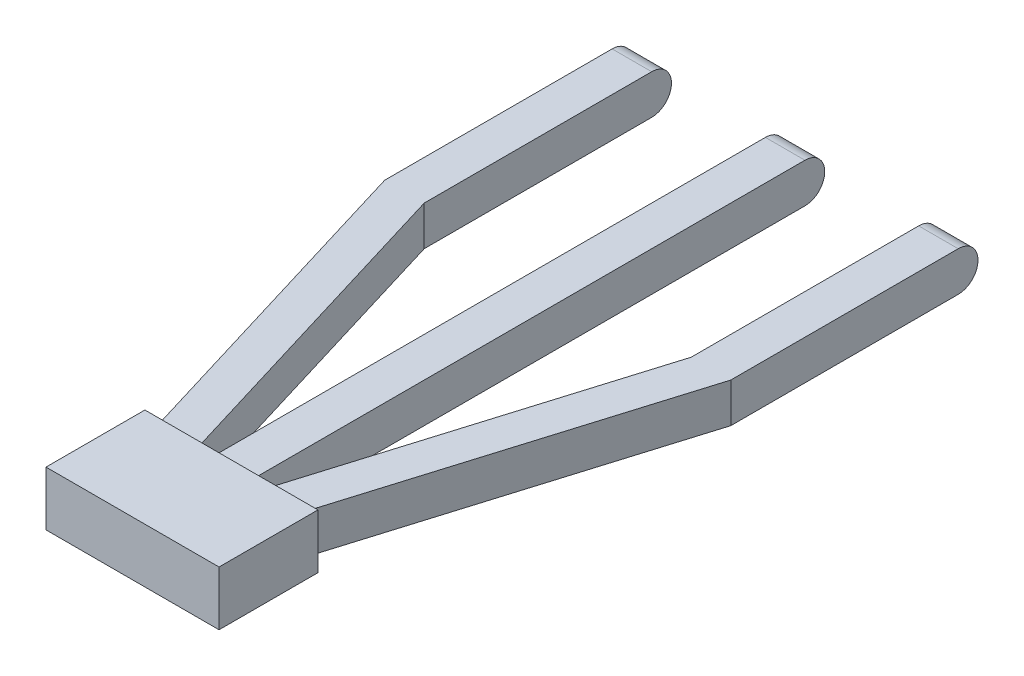
ISO-10303-21;
HEADER;
FILE_DESCRIPTION(('STEP AP214'),'2;1');
FILE_NAME('part.step','',(''),(''),'','','');
FILE_SCHEMA(('AUTOMOTIVE_DESIGN { 1 0 10303 214 1 1 1 1 }'));
ENDSEC;
DATA;
#1=APPLICATION_CONTEXT('core data for automotive mechanical design processes');
#2=APPLICATION_PROTOCOL_DEFINITION('international standard','automotive_design',2000,#1);
#3=PRODUCT_CONTEXT('',#1,'mechanical');
#4=PRODUCT('Part','Part','',(#3));
#5=PRODUCT_RELATED_PRODUCT_CATEGORY('part','',(#4));
#6=PRODUCT_DEFINITION_FORMATION('','',#4);
#7=PRODUCT_DEFINITION_CONTEXT('part definition',#1,'design');
#8=PRODUCT_DEFINITION('design','',#6,#7);
#9=PRODUCT_DEFINITION_SHAPE('','',#8);
#10=(LENGTH_UNIT() NAMED_UNIT(*) SI_UNIT(.MILLI.,.METRE.));
#11=(NAMED_UNIT(*) PLANE_ANGLE_UNIT() SI_UNIT($,.RADIAN.));
#12=(NAMED_UNIT(*) SI_UNIT($,.STERADIAN.) SOLID_ANGLE_UNIT());
#13=UNCERTAINTY_MEASURE_WITH_UNIT(LENGTH_MEASURE(1.E-05),#10,'distance_accuracy_value','');
#14=(GEOMETRIC_REPRESENTATION_CONTEXT(3) GLOBAL_UNCERTAINTY_ASSIGNED_CONTEXT((#13)) GLOBAL_UNIT_ASSIGNED_CONTEXT((#10,
#11,#12)) REPRESENTATION_CONTEXT('',''));
#15=CARTESIAN_POINT('',(0.,0.,0.));
#16=DIRECTION('',(0.,0.,1.));
#17=DIRECTION('',(1.,0.,0.));
#18=AXIS2_PLACEMENT_3D('',#15,#16,#17);
#19=CARTESIAN_POINT('',(-3.5,-0.4,5.));
#20=DIRECTION('',(1.,0.,0.));
#21=DIRECTION('',(0.,0.,-1.));
#22=AXIS2_PLACEMENT_3D('',#19,#20,#21);
#23=PLANE('',#22);
#24=CARTESIAN_POINT('',(-3.5,-0.2,0.2));
#25=DIRECTION('',(1.,0.,0.));
#26=DIRECTION('',(0.,0.,-1.));
#27=AXIS2_PLACEMENT_3D('',#24,#25,#26);
#28=CIRCLE('',#27,0.05);
#29=CARTESIAN_POINT('',(-3.5,-0.2,0.15));
#30=VERTEX_POINT('',#29);
#31=EDGE_CURVE('E658',#30,#30,#28,.T.);
#32=ORIENTED_EDGE('',*,*,#31,.T.);
#33=EDGE_LOOP('',(#32));
#34=FACE_BOUND('',#33,.T.);
#35=CARTESIAN_POINT('',(-3.5,0.,0.4));
#36=DIRECTION('',(1.,0.,0.));
#37=DIRECTION('',(0.,0.,-1.));
#38=AXIS2_PLACEMENT_3D('',#35,#36,#37);
#39=CIRCLE('',#38,0.4);
#40=CARTESIAN_POINT('',(-3.5,0.4,0.4));
#41=VERTEX_POINT('',#40);
#42=CARTESIAN_POINT('',(-3.5,0.,0.));
#43=VERTEX_POINT('',#42);
#44=EDGE_CURVE('E724',#41,#43,#39,.F.);
#45=ORIENTED_EDGE('',*,*,#44,.T.);
#46=CARTESIAN_POINT('',(-3.5,0.,0.4));
#47=DIRECTION('',(1.,0.,0.));
#48=DIRECTION('',(0.,0.,-1.));
#49=AXIS2_PLACEMENT_3D('',#46,#47,#48);
#50=CIRCLE('',#49,0.4);
#51=CARTESIAN_POINT('',(-3.5,-0.4,0.4));
#52=VERTEX_POINT('',#51);
#53=EDGE_CURVE('E727',#43,#52,#50,.F.);
#54=ORIENTED_EDGE('',*,*,#53,.T.);
#55=DIRECTION('',(0.,0.,-1.));
#56=VECTOR('',#55,1.);
#57=CARTESIAN_POINT('',(-3.5,-0.4,5.));
#58=LINE('',#57,#56);
#59=CARTESIAN_POINT('',(-3.5,-0.4,5.));
#60=VERTEX_POINT('',#59);
#61=EDGE_CURVE('E663',#60,#52,#58,.T.);
#62=ORIENTED_EDGE('',*,*,#61,.F.);
#63=DIRECTION('',(-8.06974549341158E-12,1.,2.44537742225455E-12));
#64=VECTOR('',#63,1.);
#65=CARTESIAN_POINT('',(-3.50000000000323,-4.04709963382417E-11,5.00000000000098));
#66=LINE('',#65,#64);
#67=CARTESIAN_POINT('',(-3.50000000000161,0.4,5.00000000000098));
#68=VERTEX_POINT('',#67);
#69=EDGE_CURVE('E687',#68,#60,#66,.F.);
#70=ORIENTED_EDGE('',*,*,#69,.F.);
#71=DIRECTION('',(0.,0.,-1.));
#72=VECTOR('',#71,1.);
#73=CARTESIAN_POINT('',(-3.5,0.4,5.));
#74=LINE('',#73,#72);
#75=EDGE_CURVE('E671',#68,#41,#74,.T.);
#76=ORIENTED_EDGE('',*,*,#75,.T.);
#77=EDGE_LOOP('',(#45,#54,#62,#70,#76));
#78=FACE_BOUND('',#77,.T.);
#79=ADVANCED_FACE('F87',(#34,#78),#23,.F.);
#80=CARTESIAN_POINT('',(-3.5,-0.4,5.));
#81=DIRECTION('',(0.,1.,0.));
#82=DIRECTION('',(0.,0.,1.));
#83=AXIS2_PLACEMENT_3D('',#80,#81,#82);
#84=PLANE('',#83);
#85=ORIENTED_EDGE('',*,*,#61,.T.);
#86=DIRECTION('',(1.,0.,0.));
#87=VECTOR('',#86,1.);
#88=CARTESIAN_POINT('',(-2.7,-0.4,0.4));
#89=LINE('',#88,#87);
#90=CARTESIAN_POINT('',(-2.7,-0.4,0.4));
#91=VERTEX_POINT('',#90);
#92=EDGE_CURVE('E691',#52,#91,#89,.T.);
#93=ORIENTED_EDGE('',*,*,#92,.T.);
#94=DIRECTION('',(0.,0.,-1.));
#95=VECTOR('',#94,1.);
#96=CARTESIAN_POINT('',(-2.7,-0.4,5.));
#97=LINE('',#96,#95);
#98=CARTESIAN_POINT('',(-2.7,-0.4,5.));
#99=VERTEX_POINT('',#98);
#100=EDGE_CURVE('E680',#99,#91,#97,.T.);
#101=ORIENTED_EDGE('',*,*,#100,.F.);
#102=DIRECTION('',(0.290007395282871,-1.96511938601874E-12,0.957024404433474));
#103=VECTOR('',#102,1.);
#104=CARTESIAN_POINT('',(-2.7,-0.4,5.));
#105=LINE('',#104,#103);
#106=CARTESIAN_POINT('',(-0.7,-0.400000000013553,11.6));
#107=VERTEX_POINT('',#106);
#108=EDGE_CURVE('E484',#99,#107,#105,.T.);
#109=ORIENTED_EDGE('',*,*,#108,.T.);
#110=DIRECTION('',(-1.,0.,0.));
#111=VECTOR('',#110,1.);
#112=CARTESIAN_POINT('',(-0.7,-0.400000000013553,11.6));
#113=LINE('',#112,#111);
#114=CARTESIAN_POINT('',(-1.49999999999295,-0.4,11.6));
#115=VERTEX_POINT('',#114);
#116=EDGE_CURVE('E698',#107,#115,#113,.T.);
#117=ORIENTED_EDGE('',*,*,#116,.T.);
#118=DIRECTION('',(0.290007395283807,-1.96511938601816E-12,0.95702440443319));
#119=VECTOR('',#118,1.);
#120=CARTESIAN_POINT('',(-3.5,-0.4,5.));
#121=LINE('',#120,#119);
#122=EDGE_CURVE('E489',#60,#115,#121,.T.);
#123=ORIENTED_EDGE('',*,*,#122,.F.);
#124=EDGE_LOOP('',(#85,#93,#101,#109,#117,#123));
#125=FACE_BOUND('',#124,.T.);
#126=ADVANCED_FACE('F379',(#125),#84,.F.);
#127=CARTESIAN_POINT('',(-2.7,-0.4,5.));
#128=DIRECTION('',(-1.,0.,0.));
#129=DIRECTION('',(0.,0.,1.));
#130=AXIS2_PLACEMENT_3D('',#127,#128,#129);
#131=PLANE('',#130);
#132=ORIENTED_EDGE('',*,*,#100,.T.);
#133=CARTESIAN_POINT('',(-2.7,0.,0.4));
#134=DIRECTION('',(-1.,0.,0.));
#135=DIRECTION('',(0.,0.,1.));
#136=AXIS2_PLACEMENT_3D('',#133,#134,#135);
#137=CIRCLE('',#136,0.4);
#138=CARTESIAN_POINT('',(-2.7,0.,0.));
#139=VERTEX_POINT('',#138);
#140=EDGE_CURVE('E721',#91,#139,#137,.F.);
#141=ORIENTED_EDGE('',*,*,#140,.T.);
#142=CARTESIAN_POINT('',(-2.7,0.,0.4));
#143=DIRECTION('',(-1.,0.,0.));
#144=DIRECTION('',(0.,0.,1.));
#145=AXIS2_PLACEMENT_3D('',#142,#143,#144);
#146=CIRCLE('',#145,0.4);
#147=CARTESIAN_POINT('',(-2.7,0.4,0.4));
#148=VERTEX_POINT('',#147);
#149=EDGE_CURVE('E718',#139,#148,#146,.F.);
#150=ORIENTED_EDGE('',*,*,#149,.T.);
#151=DIRECTION('',(0.,0.,-1.));
#152=VECTOR('',#151,1.);
#153=CARTESIAN_POINT('',(-2.7,0.4,5.));
#154=LINE('',#153,#152);
#155=CARTESIAN_POINT('',(-2.7,0.4,5.));
#156=VERTEX_POINT('',#155);
#157=EDGE_CURVE('E676',#156,#148,#154,.T.);
#158=ORIENTED_EDGE('',*,*,#157,.F.);
#159=DIRECTION('',(0.,1.,0.));
#160=VECTOR('',#159,1.);
#161=CARTESIAN_POINT('',(-2.7,0.,5.));
#162=LINE('',#161,#160);
#163=EDGE_CURVE('E675',#99,#156,#162,.T.);
#164=ORIENTED_EDGE('',*,*,#163,.F.);
#165=EDGE_LOOP('',(#132,#141,#150,#158,#164));
#166=FACE_BOUND('',#165,.T.);
#167=ADVANCED_FACE('F385',(#166),#131,.F.);
#168=CARTESIAN_POINT('',(-3.5,0.4,5.));
#169=DIRECTION('',(0.,-1.,0.));
#170=DIRECTION('',(0.,0.,-1.));
#171=AXIS2_PLACEMENT_3D('',#168,#169,#170);
#172=PLANE('',#171);
#173=ORIENTED_EDGE('',*,*,#157,.T.);
#174=DIRECTION('',(-1.,0.,0.));
#175=VECTOR('',#174,1.);
#176=CARTESIAN_POINT('',(-3.5,0.4,0.4));
#177=LINE('',#176,#175);
#178=EDGE_CURVE('E454',#148,#41,#177,.T.);
#179=ORIENTED_EDGE('',*,*,#178,.T.);
#180=ORIENTED_EDGE('',*,*,#75,.F.);
#181=DIRECTION('',(0.290007395282871,-1.96510366468634E-12,0.957024404433474));
#182=VECTOR('',#181,1.);
#183=CARTESIAN_POINT('',(-3.5,0.4,5.));
#184=LINE('',#183,#182);
#185=CARTESIAN_POINT('',(-1.5,0.399999999993224,11.6));
#186=VERTEX_POINT('',#185);
#187=EDGE_CURVE('E705',#68,#186,#184,.T.);
#188=ORIENTED_EDGE('',*,*,#187,.T.);
#189=DIRECTION('',(1.,0.,0.));
#190=VECTOR('',#189,1.);
#191=CARTESIAN_POINT('',(-0.7,0.399999999986448,11.6));
#192=LINE('',#191,#190);
#193=CARTESIAN_POINT('',(-0.7,0.399999999986448,11.6));
#194=VERTEX_POINT('',#193);
#195=EDGE_CURVE('E659',#186,#194,#192,.T.);
#196=ORIENTED_EDGE('',*,*,#195,.T.);
#197=DIRECTION('',(0.290007395282871,-1.96510366468634E-12,0.957024404433474));
#198=VECTOR('',#197,1.);
#199=CARTESIAN_POINT('',(-2.7,0.4,5.));
#200=LINE('',#199,#198);
#201=EDGE_CURVE('E743',#156,#194,#200,.T.);
#202=ORIENTED_EDGE('',*,*,#201,.F.);
#203=EDGE_LOOP('',(#173,#179,#180,#188,#196,#202));
#204=FACE_BOUND('',#203,.T.);
#205=ADVANCED_FACE('F396',(#204),#172,.F.);
#206=CARTESIAN_POINT('',(-3.7,-0.2,0.2));
#207=DIRECTION('',(1.,0.,0.));
#208=DIRECTION('',(0.,0.,-1.));
#209=AXIS2_PLACEMENT_3D('',#206,#207,#208);
#210=CYLINDRICAL_SURFACE('',#209,0.05);
#211=CARTESIAN_POINT('',(-3.7,-0.2,0.2));
#212=DIRECTION('',(1.,0.,0.));
#213=DIRECTION('',(0.,0.,-1.));
#214=AXIS2_PLACEMENT_3D('',#211,#212,#213);
#215=CIRCLE('',#214,0.05);
#216=CARTESIAN_POINT('',(-3.7,-0.2,0.15));
#217=VERTEX_POINT('',#216);
#218=EDGE_CURVE('E656',#217,#217,#215,.T.);
#219=ORIENTED_EDGE('',*,*,#218,.T.);
#220=EDGE_LOOP('',(#219));
#221=FACE_BOUND('',#220,.T.);
#222=ORIENTED_EDGE('',*,*,#31,.F.);
#223=EDGE_LOOP('',(#222));
#224=FACE_BOUND('',#223,.T.);
#225=ADVANCED_FACE('F391',(#221,#224),#210,.T.);
#226=CARTESIAN_POINT('',(-3.7,-0.2,0.2));
#227=DIRECTION('',(1.,0.,0.));
#228=DIRECTION('',(0.,0.,-1.));
#229=AXIS2_PLACEMENT_3D('',#226,#227,#228);
#230=PLANE('',#229);
#231=ORIENTED_EDGE('',*,*,#218,.F.);
#232=EDGE_LOOP('',(#231));
#233=FACE_BOUND('',#232,.T.);
#234=ADVANCED_FACE('F646',(#233),#230,.F.);
#235=CARTESIAN_POINT('',(-4.59335576114921,-4.04709963382417E-11,1.39192598823194));
#236=DIRECTION('',(-0.95702440443319,-8.43212091147351E-12,0.290007395283807));
#237=DIRECTION('',(0.290007395283807,0.,0.95702440443319));
#238=AXIS2_PLACEMENT_3D('',#235,#236,#237);
#239=PLANE('',#238);
#240=ORIENTED_EDGE('',*,*,#122,.T.);
#241=DIRECTION('',(-8.81076895470345E-12,1.,0.));
#242=VECTOR('',#241,1.);
#243=CARTESIAN_POINT('',(-1.5,0.399999999986448,11.6));
#244=LINE('',#243,#242);
#245=EDGE_CURVE('E701',#115,#186,#244,.T.);
#246=ORIENTED_EDGE('',*,*,#245,.T.);
#247=ORIENTED_EDGE('',*,*,#187,.F.);
#248=ORIENTED_EDGE('',*,*,#69,.T.);
#249=EDGE_LOOP('',(#240,#246,#247,#248));
#250=FACE_BOUND('',#249,.T.);
#251=ADVANCED_FACE('F640',(#250),#239,.T.);
#252=CARTESIAN_POINT('',(-3.86063919259882,0.,1.16989066442389));
#253=DIRECTION('',(0.957024404433474,0.,-0.290007395282871));
#254=DIRECTION('',(-0.290007395282871,0.,-0.957024404433474));
#255=AXIS2_PLACEMENT_3D('',#252,#253,#254);
#256=PLANE('',#255);
#257=ORIENTED_EDGE('',*,*,#201,.T.);
#258=DIRECTION('',(0.,-1.,0.));
#259=VECTOR('',#258,1.);
#260=CARTESIAN_POINT('',(-0.7,0.399999999986448,11.6));
#261=LINE('',#260,#259);
#262=EDGE_CURVE('E666',#194,#107,#261,.T.);
#263=ORIENTED_EDGE('',*,*,#262,.T.);
#264=ORIENTED_EDGE('',*,*,#108,.F.);
#265=ORIENTED_EDGE('',*,*,#163,.T.);
#266=EDGE_LOOP('',(#257,#263,#264,#265));
#267=FACE_BOUND('',#266,.T.);
#268=ADVANCED_FACE('F632',(#267),#256,.T.);
#269=CARTESIAN_POINT('',(-0.4,0.4,13.6));
#270=DIRECTION('',(1.,0.,0.));
#271=DIRECTION('',(0.,1.,0.));
#272=AXIS2_PLACEMENT_3D('',#269,#270,#271);
#273=PLANE('',#272);
#274=CARTESIAN_POINT('',(-0.4,-0.2,0.2));
#275=DIRECTION('',(1.,0.,0.));
#276=DIRECTION('',(0.,1.,0.));
#277=AXIS2_PLACEMENT_3D('',#274,#275,#276);
#278=CIRCLE('',#277,0.05);
#279=CARTESIAN_POINT('',(-0.4,-0.15,0.2));
#280=VERTEX_POINT('',#279);
#281=EDGE_CURVE('E611',#280,#280,#278,.T.);
#282=ORIENTED_EDGE('',*,*,#281,.T.);
#283=EDGE_LOOP('',(#282));
#284=FACE_BOUND('',#283,.T.);
#285=CARTESIAN_POINT('',(-0.4,0.,0.399999999999999));
#286=DIRECTION('',(1.,0.,0.));
#287=DIRECTION('',(0.,1.,0.));
#288=AXIS2_PLACEMENT_3D('',#285,#286,#287);
#289=CIRCLE('',#288,0.4);
#290=CARTESIAN_POINT('',(-0.4,0.4,0.399999999999999));
#291=VERTEX_POINT('',#290);
#292=CARTESIAN_POINT('',(-0.4,0.,0.));
#293=VERTEX_POINT('',#292);
#294=EDGE_CURVE('E105',#291,#293,#289,.F.);
#295=ORIENTED_EDGE('',*,*,#294,.T.);
#296=CARTESIAN_POINT('',(-0.4,0.,0.399999999999999));
#297=DIRECTION('',(1.,0.,0.));
#298=DIRECTION('',(0.,1.,0.));
#299=AXIS2_PLACEMENT_3D('',#296,#297,#298);
#300=CIRCLE('',#299,0.4);
#301=CARTESIAN_POINT('',(-0.4,-0.4,0.399999999999999));
#302=VERTEX_POINT('',#301);
#303=EDGE_CURVE('E97',#293,#302,#300,.F.);
#304=ORIENTED_EDGE('',*,*,#303,.T.);
#305=DIRECTION('',(0.,0.,-1.));
#306=VECTOR('',#305,1.);
#307=CARTESIAN_POINT('',(-0.4,-0.4,13.6));
#308=LINE('',#307,#306);
#309=CARTESIAN_POINT('',(-0.4,-0.4,11.6));
#310=VERTEX_POINT('',#309);
#311=EDGE_CURVE('E479',#310,#302,#308,.T.);
#312=ORIENTED_EDGE('',*,*,#311,.F.);
#313=DIRECTION('',(0.,-1.,0.));
#314=VECTOR('',#313,1.);
#315=CARTESIAN_POINT('',(-0.4,0.4,11.6));
#316=LINE('',#315,#314);
#317=CARTESIAN_POINT('',(-0.4,0.4,11.6));
#318=VERTEX_POINT('',#317);
#319=EDGE_CURVE('E625',#318,#310,#316,.T.);
#320=ORIENTED_EDGE('',*,*,#319,.F.);
#321=DIRECTION('',(0.,0.,-1.));
#322=VECTOR('',#321,1.);
#323=CARTESIAN_POINT('',(-0.4,0.4,13.6));
#324=LINE('',#323,#322);
#325=EDGE_CURVE('E615',#318,#291,#324,.T.);
#326=ORIENTED_EDGE('',*,*,#325,.T.);
#327=EDGE_LOOP('',(#295,#304,#312,#320,#326));
#328=FACE_BOUND('',#327,.T.);
#329=ADVANCED_FACE('F630',(#284,#328),#273,.F.);
#330=CARTESIAN_POINT('',(0.4,-0.4,13.6));
#331=DIRECTION('',(0.,1.,0.));
#332=DIRECTION('',(-1.,0.,0.));
#333=AXIS2_PLACEMENT_3D('',#330,#331,#332);
#334=PLANE('',#333);
#335=ORIENTED_EDGE('',*,*,#311,.T.);
#336=DIRECTION('',(1.,0.,0.));
#337=VECTOR('',#336,1.);
#338=CARTESIAN_POINT('',(0.4,-0.4,0.399999999999999));
#339=LINE('',#338,#337);
#340=CARTESIAN_POINT('',(0.4,-0.4,0.399999999999999));
#341=VERTEX_POINT('',#340);
#342=EDGE_CURVE('E422',#302,#341,#339,.T.);
#343=ORIENTED_EDGE('',*,*,#342,.T.);
#344=DIRECTION('',(0.,0.,-1.));
#345=VECTOR('',#344,1.);
#346=CARTESIAN_POINT('',(0.4,-0.4,13.6));
#347=LINE('',#346,#345);
#348=CARTESIAN_POINT('',(0.4,-0.4,11.6));
#349=VERTEX_POINT('',#348);
#350=EDGE_CURVE('E475',#349,#341,#347,.T.);
#351=ORIENTED_EDGE('',*,*,#350,.F.);
#352=DIRECTION('',(1.,0.,0.));
#353=VECTOR('',#352,1.);
#354=CARTESIAN_POINT('',(-0.4,-0.4,11.6));
#355=LINE('',#354,#353);
#356=EDGE_CURVE('E480',#310,#349,#355,.T.);
#357=ORIENTED_EDGE('',*,*,#356,.F.);
#358=EDGE_LOOP('',(#335,#343,#351,#357));
#359=FACE_BOUND('',#358,.T.);
#360=ADVANCED_FACE('F477',(#359),#334,.F.);
#361=CARTESIAN_POINT('',(0.4,0.4,13.6));
#362=DIRECTION('',(-1.,0.,0.));
#363=DIRECTION('',(0.,-1.,0.));
#364=AXIS2_PLACEMENT_3D('',#361,#362,#363);
#365=PLANE('',#364);
#366=ORIENTED_EDGE('',*,*,#350,.T.);
#367=CARTESIAN_POINT('',(0.4,0.,0.399999999999999));
#368=DIRECTION('',(-1.,0.,0.));
#369=DIRECTION('',(0.,-1.,0.));
#370=AXIS2_PLACEMENT_3D('',#367,#368,#369);
#371=CIRCLE('',#370,0.4);
#372=CARTESIAN_POINT('',(0.4,0.,0.));
#373=VERTEX_POINT('',#372);
#374=EDGE_CURVE('E428',#341,#373,#371,.F.);
#375=ORIENTED_EDGE('',*,*,#374,.T.);
#376=CARTESIAN_POINT('',(0.4,0.,0.399999999999999));
#377=DIRECTION('',(-1.,0.,0.));
#378=DIRECTION('',(0.,-1.,0.));
#379=AXIS2_PLACEMENT_3D('',#376,#377,#378);
#380=CIRCLE('',#379,0.4);
#381=CARTESIAN_POINT('',(0.4,0.4,0.399999999999999));
#382=VERTEX_POINT('',#381);
#383=EDGE_CURVE('E466',#373,#382,#380,.F.);
#384=ORIENTED_EDGE('',*,*,#383,.T.);
#385=DIRECTION('',(0.,0.,-1.));
#386=VECTOR('',#385,1.);
#387=CARTESIAN_POINT('',(0.4,0.4,13.6));
#388=LINE('',#387,#386);
#389=CARTESIAN_POINT('',(0.4,0.4,11.6));
#390=VERTEX_POINT('',#389);
#391=EDGE_CURVE('E491',#390,#382,#388,.T.);
#392=ORIENTED_EDGE('',*,*,#391,.F.);
#393=DIRECTION('',(0.,-1.,0.));
#394=VECTOR('',#393,1.);
#395=CARTESIAN_POINT('',(0.4,0.4,11.6));
#396=LINE('',#395,#394);
#397=EDGE_CURVE('E619',#390,#349,#396,.T.);
#398=ORIENTED_EDGE('',*,*,#397,.T.);
#399=EDGE_LOOP('',(#366,#375,#384,#392,#398));
#400=FACE_BOUND('',#399,.T.);
#401=ADVANCED_FACE('F472',(#400),#365,.F.);
#402=CARTESIAN_POINT('',(0.4,0.4,13.6));
#403=DIRECTION('',(0.,-1.,0.));
#404=DIRECTION('',(1.,0.,0.));
#405=AXIS2_PLACEMENT_3D('',#402,#403,#404);
#406=PLANE('',#405);
#407=ORIENTED_EDGE('',*,*,#391,.T.);
#408=DIRECTION('',(-1.,0.,0.));
#409=VECTOR('',#408,1.);
#410=CARTESIAN_POINT('',(-0.4,0.4,0.399999999999999));
#411=LINE('',#410,#409);
#412=EDGE_CURVE('E12',#382,#291,#411,.T.);
#413=ORIENTED_EDGE('',*,*,#412,.T.);
#414=ORIENTED_EDGE('',*,*,#325,.F.);
#415=DIRECTION('',(1.,0.,0.));
#416=VECTOR('',#415,1.);
#417=CARTESIAN_POINT('',(-0.4,0.4,11.6));
#418=LINE('',#417,#416);
#419=EDGE_CURVE('E552',#318,#390,#418,.T.);
#420=ORIENTED_EDGE('',*,*,#419,.T.);
#421=EDGE_LOOP('',(#407,#413,#414,#420));
#422=FACE_BOUND('',#421,.T.);
#423=ADVANCED_FACE('F618',(#422),#406,.F.);
#424=CARTESIAN_POINT('',(-0.6,-0.2,0.2));
#425=DIRECTION('',(1.,0.,0.));
#426=DIRECTION('',(0.,1.,0.));
#427=AXIS2_PLACEMENT_3D('',#424,#425,#426);
#428=CYLINDRICAL_SURFACE('',#427,0.05);
#429=CARTESIAN_POINT('',(-0.6,-0.2,0.2));
#430=DIRECTION('',(1.,0.,0.));
#431=DIRECTION('',(0.,1.,0.));
#432=AXIS2_PLACEMENT_3D('',#429,#430,#431);
#433=CIRCLE('',#432,0.05);
#434=CARTESIAN_POINT('',(-0.6,-0.15,0.2));
#435=VERTEX_POINT('',#434);
#436=EDGE_CURVE('E577',#435,#435,#433,.T.);
#437=ORIENTED_EDGE('',*,*,#436,.T.);
#438=EDGE_LOOP('',(#437));
#439=FACE_BOUND('',#438,.T.);
#440=ORIENTED_EDGE('',*,*,#281,.F.);
#441=EDGE_LOOP('',(#440));
#442=FACE_BOUND('',#441,.T.);
#443=ADVANCED_FACE('F798',(#439,#442),#428,.T.);
#444=CARTESIAN_POINT('',(-0.6,-0.2,0.2));
#445=DIRECTION('',(1.,0.,0.));
#446=DIRECTION('',(0.,1.,0.));
#447=AXIS2_PLACEMENT_3D('',#444,#445,#446);
#448=PLANE('',#447);
#449=ORIENTED_EDGE('',*,*,#436,.F.);
#450=EDGE_LOOP('',(#449));
#451=FACE_BOUND('',#450,.T.);
#452=ADVANCED_FACE('F807',(#451),#448,.F.);
#453=CARTESIAN_POINT('',(1.75,0.,11.6));
#454=DIRECTION('',(-1.,0.,0.));
#455=DIRECTION('',(0.,-1.,0.));
#456=AXIS2_PLACEMENT_3D('',#453,#454,#455);
#457=PLANE('',#456);
#458=DIRECTION('',(0.,-1.,0.));
#459=VECTOR('',#458,1.);
#460=CARTESIAN_POINT('',(1.75,0.,13.6));
#461=LINE('',#460,#459);
#462=CARTESIAN_POINT('',(1.75,0.55,13.6));
#463=VERTEX_POINT('',#462);
#464=CARTESIAN_POINT('',(1.75,-0.55,13.6));
#465=VERTEX_POINT('',#464);
#466=EDGE_CURVE('E572',#463,#465,#461,.T.);
#467=ORIENTED_EDGE('',*,*,#466,.T.);
#468=DIRECTION('',(0.,0.,1.));
#469=VECTOR('',#468,1.);
#470=CARTESIAN_POINT('',(1.75,-0.55,11.6));
#471=LINE('',#470,#469);
#472=CARTESIAN_POINT('',(1.75,-0.55,11.6));
#473=VERTEX_POINT('',#472);
#474=EDGE_CURVE('E569',#473,#465,#471,.T.);
#475=ORIENTED_EDGE('',*,*,#474,.F.);
#476=DIRECTION('',(0.,-1.,0.));
#477=VECTOR('',#476,1.);
#478=CARTESIAN_POINT('',(1.75,0.,11.6));
#479=LINE('',#478,#477);
#480=CARTESIAN_POINT('',(1.75,0.55,11.6));
#481=VERTEX_POINT('',#480);
#482=EDGE_CURVE('E555',#481,#473,#479,.T.);
#483=ORIENTED_EDGE('',*,*,#482,.F.);
#484=DIRECTION('',(0.,0.,1.));
#485=VECTOR('',#484,1.);
#486=CARTESIAN_POINT('',(1.75,0.55,11.6));
#487=LINE('',#486,#485);
#488=EDGE_CURVE('E583',#481,#463,#487,.T.);
#489=ORIENTED_EDGE('',*,*,#488,.T.);
#490=EDGE_LOOP('',(#467,#475,#483,#489));
#491=FACE_BOUND('',#490,.T.);
#492=ADVANCED_FACE('F570',(#491),#457,.F.);
#493=CARTESIAN_POINT('',(0.,-0.55,11.6));
#494=DIRECTION('',(0.,-1.,0.));
#495=DIRECTION('',(0.,0.,-1.));
#496=AXIS2_PLACEMENT_3D('',#493,#494,#495);
#497=PLANE('',#496);
#498=DIRECTION('',(1.,0.,0.));
#499=VECTOR('',#498,1.);
#500=CARTESIAN_POINT('',(0.,-0.55,13.6));
#501=LINE('',#500,#499);
#502=CARTESIAN_POINT('',(-1.75,-0.55,13.6));
#503=VERTEX_POINT('',#502);
#504=EDGE_CURVE('E566',#503,#465,#501,.T.);
#505=ORIENTED_EDGE('',*,*,#504,.F.);
#506=DIRECTION('',(0.,0.,1.));
#507=VECTOR('',#506,1.);
#508=CARTESIAN_POINT('',(-1.75,-0.55,11.6));
#509=LINE('',#508,#507);
#510=CARTESIAN_POINT('',(-1.75,-0.55,11.6));
#511=VERTEX_POINT('',#510);
#512=EDGE_CURVE('E578',#511,#503,#509,.T.);
#513=ORIENTED_EDGE('',*,*,#512,.F.);
#514=DIRECTION('',(1.,0.,0.));
#515=VECTOR('',#514,1.);
#516=CARTESIAN_POINT('',(0.,-0.55,11.6));
#517=LINE('',#516,#515);
#518=EDGE_CURVE('E559',#511,#473,#517,.T.);
#519=ORIENTED_EDGE('',*,*,#518,.T.);
#520=ORIENTED_EDGE('',*,*,#474,.T.);
#521=EDGE_LOOP('',(#505,#513,#519,#520));
#522=FACE_BOUND('',#521,.T.);
#523=ADVANCED_FACE('F580',(#522),#497,.T.);
#524=CARTESIAN_POINT('',(-1.75,0.,11.6));
#525=DIRECTION('',(-1.,0.,0.));
#526=DIRECTION('',(0.,-1.,0.));
#527=AXIS2_PLACEMENT_3D('',#524,#525,#526);
#528=PLANE('',#527);
#529=DIRECTION('',(0.,-1.,0.));
#530=VECTOR('',#529,1.);
#531=CARTESIAN_POINT('',(-1.75,0.,13.6));
#532=LINE('',#531,#530);
#533=CARTESIAN_POINT('',(-1.75,0.55,13.6));
#534=VERTEX_POINT('',#533);
#535=EDGE_CURVE('E598',#534,#503,#532,.T.);
#536=ORIENTED_EDGE('',*,*,#535,.F.);
#537=DIRECTION('',(0.,0.,1.));
#538=VECTOR('',#537,1.);
#539=CARTESIAN_POINT('',(-1.75,0.55,11.6));
#540=LINE('',#539,#538);
#541=CARTESIAN_POINT('',(-1.75,0.55,11.6));
#542=VERTEX_POINT('',#541);
#543=EDGE_CURVE('E588',#542,#534,#540,.T.);
#544=ORIENTED_EDGE('',*,*,#543,.F.);
#545=DIRECTION('',(0.,-1.,0.));
#546=VECTOR('',#545,1.);
#547=CARTESIAN_POINT('',(-1.75,0.,11.6));
#548=LINE('',#547,#546);
#549=EDGE_CURVE('E584',#542,#511,#548,.T.);
#550=ORIENTED_EDGE('',*,*,#549,.T.);
#551=ORIENTED_EDGE('',*,*,#512,.T.);
#552=EDGE_LOOP('',(#536,#544,#550,#551));
#553=FACE_BOUND('',#552,.T.);
#554=ADVANCED_FACE('F831',(#553),#528,.T.);
#555=CARTESIAN_POINT('',(0.,0.55,11.6));
#556=DIRECTION('',(0.,-1.,0.));
#557=DIRECTION('',(0.,0.,-1.));
#558=AXIS2_PLACEMENT_3D('',#555,#556,#557);
#559=PLANE('',#558);
#560=DIRECTION('',(1.,0.,0.));
#561=VECTOR('',#560,1.);
#562=CARTESIAN_POINT('',(0.,0.55,13.6));
#563=LINE('',#562,#561);
#564=EDGE_CURVE('E595',#534,#463,#563,.T.);
#565=ORIENTED_EDGE('',*,*,#564,.T.);
#566=ORIENTED_EDGE('',*,*,#488,.F.);
#567=DIRECTION('',(1.,0.,0.));
#568=VECTOR('',#567,1.);
#569=CARTESIAN_POINT('',(0.,0.55,11.6));
#570=LINE('',#569,#568);
#571=EDGE_CURVE('E561',#542,#481,#570,.T.);
#572=ORIENTED_EDGE('',*,*,#571,.F.);
#573=ORIENTED_EDGE('',*,*,#543,.T.);
#574=EDGE_LOOP('',(#565,#566,#572,#573));
#575=FACE_BOUND('',#574,.T.);
#576=ADVANCED_FACE('F547',(#575),#559,.F.);
#577=CARTESIAN_POINT('',(0.,0.,11.6));
#578=DIRECTION('',(0.,0.,1.));
#579=DIRECTION('',(1.,0.,0.));
#580=AXIS2_PLACEMENT_3D('',#577,#578,#579);
#581=PLANE('',#580);
#582=ORIENTED_EDGE('',*,*,#245,.F.);
#583=ORIENTED_EDGE('',*,*,#116,.F.);
#584=ORIENTED_EDGE('',*,*,#262,.F.);
#585=ORIENTED_EDGE('',*,*,#195,.F.);
#586=EDGE_LOOP('',(#582,#583,#584,#585));
#587=FACE_BOUND('',#586,.T.);
#588=DIRECTION('',(-1.,0.,0.));
#589=VECTOR('',#588,1.);
#590=CARTESIAN_POINT('',(1.5,-0.400000000013553,11.6));
#591=LINE('',#590,#589);
#592=CARTESIAN_POINT('',(1.5,-0.400000000013553,11.6));
#593=VERTEX_POINT('',#592);
#594=CARTESIAN_POINT('',(0.699999999997627,-0.400000000013553,11.5999999999993));
#595=VERTEX_POINT('',#594);
#596=EDGE_CURVE('E276',#593,#595,#591,.T.);
#597=ORIENTED_EDGE('',*,*,#596,.F.);
#598=DIRECTION('',(0.,-1.,0.));
#599=VECTOR('',#598,1.);
#600=CARTESIAN_POINT('',(1.5,0.4,11.6));
#601=LINE('',#600,#599);
#602=CARTESIAN_POINT('',(1.5,0.4,11.6));
#603=VERTEX_POINT('',#602);
#604=EDGE_CURVE('E501',#603,#593,#601,.T.);
#605=ORIENTED_EDGE('',*,*,#604,.F.);
#606=DIRECTION('',(1.,0.,0.));
#607=VECTOR('',#606,1.);
#608=CARTESIAN_POINT('',(1.5,0.4,11.6));
#609=LINE('',#608,#607);
#610=CARTESIAN_POINT('',(0.7,0.4,11.6));
#611=VERTEX_POINT('',#610);
#612=EDGE_CURVE('E504',#611,#603,#609,.T.);
#613=ORIENTED_EDGE('',*,*,#612,.F.);
#614=DIRECTION('',(6.48027638483608E-12,1.,0.));
#615=VECTOR('',#614,1.);
#616=CARTESIAN_POINT('',(0.7,0.4,11.6));
#617=LINE('',#616,#615);
#618=EDGE_CURVE('E258',#595,#611,#617,.T.);
#619=ORIENTED_EDGE('',*,*,#618,.F.);
#620=EDGE_LOOP('',(#597,#605,#613,#619));
#621=FACE_BOUND('',#620,.T.);
#622=ORIENTED_EDGE('',*,*,#419,.F.);
#623=ORIENTED_EDGE('',*,*,#319,.T.);
#624=ORIENTED_EDGE('',*,*,#356,.T.);
#625=ORIENTED_EDGE('',*,*,#397,.F.);
#626=EDGE_LOOP('',(#622,#623,#624,#625));
#627=FACE_BOUND('',#626,.T.);
#628=ORIENTED_EDGE('',*,*,#482,.T.);
#629=ORIENTED_EDGE('',*,*,#518,.F.);
#630=ORIENTED_EDGE('',*,*,#549,.F.);
#631=ORIENTED_EDGE('',*,*,#571,.T.);
#632=EDGE_LOOP('',(#628,#629,#630,#631));
#633=FACE_BOUND('',#632,.T.);
#634=ADVANCED_FACE('F321',(#587,#621,#627,#633),#581,.F.);
#635=CARTESIAN_POINT('',(0.,0.,13.6));
#636=DIRECTION('',(0.,0.,-1.));
#637=DIRECTION('',(-1.,0.,0.));
#638=AXIS2_PLACEMENT_3D('',#635,#636,#637);
#639=PLANE('',#638);
#640=ORIENTED_EDGE('',*,*,#466,.F.);
#641=ORIENTED_EDGE('',*,*,#564,.F.);
#642=ORIENTED_EDGE('',*,*,#535,.T.);
#643=ORIENTED_EDGE('',*,*,#504,.T.);
#644=EDGE_LOOP('',(#640,#641,#642,#643));
#645=FACE_BOUND('',#644,.T.);
#646=ADVANCED_FACE('F310',(#645),#639,.F.);
#647=CARTESIAN_POINT('',(4.59335576114382,0.,1.3919259882254));
#648=DIRECTION('',(0.957024404433474,0.,0.290007395282871));
#649=DIRECTION('',(0.290007395282871,0.,-0.957024404433474));
#650=AXIS2_PLACEMENT_3D('',#647,#648,#649);
#651=PLANE('',#650);
#652=DIRECTION('',(0.290007395282871,1.96518227134834E-12,-0.957024404433474));
#653=VECTOR('',#652,1.);
#654=CARTESIAN_POINT('',(1.5,-0.400000000013553,11.6));
#655=LINE('',#654,#653);
#656=CARTESIAN_POINT('',(3.5,-0.4,5.));
#657=VERTEX_POINT('',#656);
#658=EDGE_CURVE('E285',#593,#657,#655,.T.);
#659=ORIENTED_EDGE('',*,*,#658,.T.);
#660=DIRECTION('',(0.,1.,0.));
#661=VECTOR('',#660,1.);
#662=CARTESIAN_POINT('',(3.5,-0.4,5.));
#663=LINE('',#662,#661);
#664=CARTESIAN_POINT('',(3.5,0.4,5.));
#665=VERTEX_POINT('',#664);
#666=EDGE_CURVE('E269',#657,#665,#663,.T.);
#667=ORIENTED_EDGE('',*,*,#666,.T.);
#668=DIRECTION('',(0.290007395282871,0.,-0.957024404433474));
#669=VECTOR('',#668,1.);
#670=CARTESIAN_POINT('',(1.5,0.4,11.6));
#671=LINE('',#670,#669);
#672=EDGE_CURVE('E279',#603,#665,#671,.T.);
#673=ORIENTED_EDGE('',*,*,#672,.F.);
#674=ORIENTED_EDGE('',*,*,#604,.T.);
#675=EDGE_LOOP('',(#659,#667,#673,#674));
#676=FACE_BOUND('',#675,.T.);
#677=ADVANCED_FACE('F299',(#676),#651,.T.);
#678=CARTESIAN_POINT('',(0.,0.4,0.));
#679=DIRECTION('',(0.,1.,0.));
#680=DIRECTION('',(0.,0.,1.));
#681=AXIS2_PLACEMENT_3D('',#678,#679,#680);
#682=PLANE('',#681);
#683=DIRECTION('',(0.,0.,-1.));
#684=VECTOR('',#683,1.);
#685=CARTESIAN_POINT('',(3.5,0.4,5.));
#686=LINE('',#685,#684);
#687=CARTESIAN_POINT('',(3.5,0.4,0.4));
#688=VERTEX_POINT('',#687);
#689=EDGE_CURVE('E339',#665,#688,#686,.T.);
#690=ORIENTED_EDGE('',*,*,#689,.T.);
#691=DIRECTION('',(-1.,0.,0.));
#692=VECTOR('',#691,1.);
#693=CARTESIAN_POINT('',(0.,0.4,0.4));
#694=LINE('',#693,#692);
#695=CARTESIAN_POINT('',(2.7,0.4,0.4));
#696=VERTEX_POINT('',#695);
#697=EDGE_CURVE('E447',#688,#696,#694,.T.);
#698=ORIENTED_EDGE('',*,*,#697,.T.);
#699=DIRECTION('',(0.,0.,-1.));
#700=VECTOR('',#699,1.);
#701=CARTESIAN_POINT('',(2.7,0.4,5.));
#702=LINE('',#701,#700);
#703=CARTESIAN_POINT('',(2.7,0.4,5.));
#704=VERTEX_POINT('',#703);
#705=EDGE_CURVE('E343',#704,#696,#702,.T.);
#706=ORIENTED_EDGE('',*,*,#705,.F.);
#707=DIRECTION('',(0.290007395282871,0.,-0.957024404433474));
#708=VECTOR('',#707,1.);
#709=CARTESIAN_POINT('',(0.7,0.4,11.6));
#710=LINE('',#709,#708);
#711=EDGE_CURVE('E267',#611,#704,#710,.T.);
#712=ORIENTED_EDGE('',*,*,#711,.F.);
#713=ORIENTED_EDGE('',*,*,#612,.T.);
#714=ORIENTED_EDGE('',*,*,#672,.T.);
#715=EDGE_LOOP('',(#690,#698,#706,#712,#713,#714));
#716=FACE_BOUND('',#715,.T.);
#717=ADVANCED_FACE('F309',(#716),#682,.T.);
#718=CARTESIAN_POINT('',(0.,-0.399999999989733,-8.21368567626034E-13));
#719=DIRECTION('',(0.,-1.,-2.05342141911779E-12));
#720=DIRECTION('',(0.,2.05342141911779E-12,-1.));
#721=AXIS2_PLACEMENT_3D('',#718,#719,#720);
#722=PLANE('',#721);
#723=DIRECTION('',(0.,0.,-1.));
#724=VECTOR('',#723,1.);
#725=CARTESIAN_POINT('',(2.7,-0.4,5.));
#726=LINE('',#725,#724);
#727=CARTESIAN_POINT('',(2.7,-0.4,5.));
#728=VERTEX_POINT('',#727);
#729=CARTESIAN_POINT('',(2.7,-0.4,0.399999999999179));
#730=VERTEX_POINT('',#729);
#731=EDGE_CURVE('E244',#728,#730,#726,.T.);
#732=ORIENTED_EDGE('',*,*,#731,.T.);
#733=DIRECTION('',(1.,0.,0.));
#734=VECTOR('',#733,1.);
#735=CARTESIAN_POINT('',(0.,-0.399999999990554,0.399999999999179));
#736=LINE('',#735,#734);
#737=CARTESIAN_POINT('',(3.5,-0.4,0.399999999999179));
#738=VERTEX_POINT('',#737);
#739=EDGE_CURVE('E449',#730,#738,#736,.T.);
#740=ORIENTED_EDGE('',*,*,#739,.T.);
#741=DIRECTION('',(0.,0.,-1.));
#742=VECTOR('',#741,1.);
#743=CARTESIAN_POINT('',(3.5,-0.4,5.));
#744=LINE('',#743,#742);
#745=EDGE_CURVE('E259',#657,#738,#744,.T.);
#746=ORIENTED_EDGE('',*,*,#745,.F.);
#747=ORIENTED_EDGE('',*,*,#658,.F.);
#748=ORIENTED_EDGE('',*,*,#596,.T.);
#749=DIRECTION('',(0.290007395283559,1.96517441068171E-12,-0.957024404433265));
#750=VECTOR('',#749,1.);
#751=CARTESIAN_POINT('',(0.699999999994816,-0.400000000013553,11.6));
#752=LINE('',#751,#750);
#753=EDGE_CURVE('E264',#595,#728,#752,.T.);
#754=ORIENTED_EDGE('',*,*,#753,.T.);
#755=EDGE_LOOP('',(#732,#740,#746,#747,#748,#754));
#756=FACE_BOUND('',#755,.T.);
#757=ADVANCED_FACE('F273',(#756),#722,.T.);
#758=CARTESIAN_POINT('',(3.86063919259882,0.,1.16989066442389));
#759=DIRECTION('',(-0.957024404433474,0.,-0.290007395282871));
#760=DIRECTION('',(-0.290007395282871,0.,0.957024404433474));
#761=AXIS2_PLACEMENT_3D('',#758,#759,#760);
#762=PLANE('',#761);
#763=ORIENTED_EDGE('',*,*,#711,.T.);
#764=DIRECTION('',(0.,-1.,0.));
#765=VECTOR('',#764,1.);
#766=CARTESIAN_POINT('',(2.7,-0.4,5.));
#767=LINE('',#766,#765);
#768=EDGE_CURVE('E248',#704,#728,#767,.T.);
#769=ORIENTED_EDGE('',*,*,#768,.T.);
#770=ORIENTED_EDGE('',*,*,#753,.F.);
#771=ORIENTED_EDGE('',*,*,#618,.T.);
#772=EDGE_LOOP('',(#763,#769,#770,#771));
#773=FACE_BOUND('',#772,.T.);
#774=ADVANCED_FACE('F263',(#773),#762,.T.);
#775=CARTESIAN_POINT('',(2.7,-0.4,5.));
#776=DIRECTION('',(1.,0.,0.));
#777=DIRECTION('',(0.,0.,-1.));
#778=AXIS2_PLACEMENT_3D('',#775,#776,#777);
#779=PLANE('',#778);
#780=CARTESIAN_POINT('',(2.7,-0.199999999999999,0.2));
#781=DIRECTION('',(1.,0.,0.));
#782=DIRECTION('',(0.,0.,-1.));
#783=AXIS2_PLACEMENT_3D('',#780,#781,#782);
#784=CIRCLE('',#783,0.05);
#785=CARTESIAN_POINT('',(2.7,-0.199999999999999,0.15));
#786=VERTEX_POINT('',#785);
#787=EDGE_CURVE('E528',#786,#786,#784,.T.);
#788=ORIENTED_EDGE('',*,*,#787,.T.);
#789=EDGE_LOOP('',(#788));
#790=FACE_BOUND('',#789,.T.);
#791=CARTESIAN_POINT('',(2.7,0.,0.4));
#792=DIRECTION('',(1.,0.,0.));
#793=DIRECTION('',(0.,0.,-1.));
#794=AXIS2_PLACEMENT_3D('',#791,#792,#793);
#795=CIRCLE('',#794,0.4);
#796=CARTESIAN_POINT('',(2.7,0.,0.));
#797=VERTEX_POINT('',#796);
#798=EDGE_CURVE('E445',#696,#797,#795,.F.);
#799=ORIENTED_EDGE('',*,*,#798,.T.);
#800=CARTESIAN_POINT('',(2.7,9.44586337546474E-12,0.4));
#801=DIRECTION('',(1.,0.,0.));
#802=DIRECTION('',(0.,0.,-1.));
#803=AXIS2_PLACEMENT_3D('',#800,#801,#802);
#804=CIRCLE('',#803,0.4);
#805=EDGE_CURVE('E252',#797,#730,#804,.F.);
#806=ORIENTED_EDGE('',*,*,#805,.T.);
#807=ORIENTED_EDGE('',*,*,#731,.F.);
#808=ORIENTED_EDGE('',*,*,#768,.F.);
#809=ORIENTED_EDGE('',*,*,#705,.T.);
#810=EDGE_LOOP('',(#799,#806,#807,#808,#809));
#811=FACE_BOUND('',#810,.T.);
#812=ADVANCED_FACE('F246',(#790,#811),#779,.F.);
#813=CARTESIAN_POINT('',(3.5,-0.4,5.));
#814=DIRECTION('',(-1.,0.,0.));
#815=DIRECTION('',(0.,0.,1.));
#816=AXIS2_PLACEMENT_3D('',#813,#814,#815);
#817=PLANE('',#816);
#818=ORIENTED_EDGE('',*,*,#745,.T.);
#819=CARTESIAN_POINT('',(3.5,9.44586337546474E-12,0.4));
#820=DIRECTION('',(-1.,0.,0.));
#821=DIRECTION('',(0.,0.,1.));
#822=AXIS2_PLACEMENT_3D('',#819,#820,#821);
#823=CIRCLE('',#822,0.4);
#824=CARTESIAN_POINT('',(3.5,0.,0.));
#825=VERTEX_POINT('',#824);
#826=EDGE_CURVE('E441',#738,#825,#823,.F.);
#827=ORIENTED_EDGE('',*,*,#826,.T.);
#828=CARTESIAN_POINT('',(3.5,0.,0.4));
#829=DIRECTION('',(-1.,0.,0.));
#830=DIRECTION('',(0.,0.,1.));
#831=AXIS2_PLACEMENT_3D('',#828,#829,#830);
#832=CIRCLE('',#831,0.4);
#833=EDGE_CURVE('E446',#825,#688,#832,.F.);
#834=ORIENTED_EDGE('',*,*,#833,.T.);
#835=ORIENTED_EDGE('',*,*,#689,.F.);
#836=ORIENTED_EDGE('',*,*,#666,.F.);
#837=EDGE_LOOP('',(#818,#827,#834,#835,#836));
#838=FACE_BOUND('',#837,.T.);
#839=ADVANCED_FACE('F354',(#838),#817,.F.);
#840=CARTESIAN_POINT('',(2.5,-0.199999999999999,0.2));
#841=DIRECTION('',(1.,0.,0.));
#842=DIRECTION('',(0.,0.,-1.));
#843=AXIS2_PLACEMENT_3D('',#840,#841,#842);
#844=CYLINDRICAL_SURFACE('',#843,0.05);
#845=CARTESIAN_POINT('',(2.5,-0.199999999999999,0.2));
#846=DIRECTION('',(1.,0.,0.));
#847=DIRECTION('',(0.,0.,-1.));
#848=AXIS2_PLACEMENT_3D('',#845,#846,#847);
#849=CIRCLE('',#848,0.05);
#850=CARTESIAN_POINT('',(2.5,-0.199999999999999,0.15));
#851=VERTEX_POINT('',#850);
#852=EDGE_CURVE('E435',#851,#851,#849,.T.);
#853=ORIENTED_EDGE('',*,*,#852,.T.);
#854=EDGE_LOOP('',(#853));
#855=FACE_BOUND('',#854,.T.);
#856=ORIENTED_EDGE('',*,*,#787,.F.);
#857=EDGE_LOOP('',(#856));
#858=FACE_BOUND('',#857,.T.);
#859=ADVANCED_FACE('F363',(#855,#858),#844,.T.);
#860=CARTESIAN_POINT('',(2.5,-0.199999999999999,0.2));
#861=DIRECTION('',(1.,0.,0.));
#862=DIRECTION('',(0.,0.,-1.));
#863=AXIS2_PLACEMENT_3D('',#860,#861,#862);
#864=PLANE('',#863);
#865=ORIENTED_EDGE('',*,*,#852,.F.);
#866=EDGE_LOOP('',(#865));
#867=FACE_BOUND('',#866,.T.);
#868=ADVANCED_FACE('F366',(#867),#864,.F.);
#869=CARTESIAN_POINT('',(-3.5,0.,0.4));
#870=DIRECTION('',(1.,0.,0.));
#871=DIRECTION('',(0.,0.,-1.));
#872=AXIS2_PLACEMENT_3D('',#869,#870,#871);
#873=CYLINDRICAL_SURFACE('',#872,0.4);
#874=DIRECTION('',(-1.,0.,0.));
#875=VECTOR('',#874,1.);
#876=CARTESIAN_POINT('',(-2.7,0.,0.));
#877=LINE('',#876,#875);
#878=EDGE_CURVE('E432',#43,#139,#877,.F.);
#879=ORIENTED_EDGE('',*,*,#878,.F.);
#880=ORIENTED_EDGE('',*,*,#44,.F.);
#881=ORIENTED_EDGE('',*,*,#178,.F.);
#882=ORIENTED_EDGE('',*,*,#149,.F.);
#883=EDGE_LOOP('',(#879,#880,#881,#882));
#884=FACE_BOUND('',#883,.T.);
#885=ADVANCED_FACE('F369',(#884),#873,.T.);
#886=CARTESIAN_POINT('',(-3.5,0.,0.4));
#887=DIRECTION('',(-1.,0.,0.));
#888=DIRECTION('',(0.,0.,1.));
#889=AXIS2_PLACEMENT_3D('',#886,#887,#888);
#890=CYLINDRICAL_SURFACE('',#889,0.4);
#891=ORIENTED_EDGE('',*,*,#53,.F.);
#892=ORIENTED_EDGE('',*,*,#878,.T.);
#893=ORIENTED_EDGE('',*,*,#140,.F.);
#894=ORIENTED_EDGE('',*,*,#92,.F.);
#895=EDGE_LOOP('',(#891,#892,#893,#894));
#896=FACE_BOUND('',#895,.T.);
#897=ADVANCED_FACE('F375',(#896),#890,.T.);
#898=CARTESIAN_POINT('',(0.,0.,0.4));
#899=DIRECTION('',(-1.,0.,0.));
#900=DIRECTION('',(0.,0.,1.));
#901=AXIS2_PLACEMENT_3D('',#898,#899,#900);
#902=CYLINDRICAL_SURFACE('',#901,0.4);
#903=DIRECTION('',(-1.,0.,0.));
#904=VECTOR('',#903,1.);
#905=CARTESIAN_POINT('',(0.,0.,0.));
#906=LINE('',#905,#904);
#907=EDGE_CURVE('E436',#797,#825,#906,.F.);
#908=ORIENTED_EDGE('',*,*,#907,.F.);
#909=ORIENTED_EDGE('',*,*,#798,.F.);
#910=ORIENTED_EDGE('',*,*,#697,.F.);
#911=ORIENTED_EDGE('',*,*,#833,.F.);
#912=EDGE_LOOP('',(#908,#909,#910,#911));
#913=FACE_BOUND('',#912,.T.);
#914=ADVANCED_FACE('F402',(#913),#902,.T.);
#915=CARTESIAN_POINT('',(0.,9.44586337546474E-12,0.4));
#916=DIRECTION('',(1.,0.,0.));
#917=DIRECTION('',(0.,0.,-1.));
#918=AXIS2_PLACEMENT_3D('',#915,#916,#917);
#919=CYLINDRICAL_SURFACE('',#918,0.4);
#920=ORIENTED_EDGE('',*,*,#805,.F.);
#921=ORIENTED_EDGE('',*,*,#907,.T.);
#922=ORIENTED_EDGE('',*,*,#826,.F.);
#923=ORIENTED_EDGE('',*,*,#739,.F.);
#924=EDGE_LOOP('',(#920,#921,#922,#923));
#925=FACE_BOUND('',#924,.T.);
#926=ADVANCED_FACE('F405',(#925),#919,.T.);
#927=CARTESIAN_POINT('',(0.4,0.,0.399999999999999));
#928=DIRECTION('',(1.,0.,0.));
#929=DIRECTION('',(0.,1.,0.));
#930=AXIS2_PLACEMENT_3D('',#927,#928,#929);
#931=CYLINDRICAL_SURFACE('',#930,0.4);
#932=DIRECTION('',(-1.,0.,0.));
#933=VECTOR('',#932,1.);
#934=CARTESIAN_POINT('',(0.4,0.,0.));
#935=LINE('',#934,#933);
#936=EDGE_CURVE('E91',#293,#373,#935,.F.);
#937=ORIENTED_EDGE('',*,*,#936,.F.);
#938=ORIENTED_EDGE('',*,*,#294,.F.);
#939=ORIENTED_EDGE('',*,*,#412,.F.);
#940=ORIENTED_EDGE('',*,*,#383,.F.);
#941=EDGE_LOOP('',(#937,#938,#939,#940));
#942=FACE_BOUND('',#941,.T.);
#943=ADVANCED_FACE('F89',(#942),#931,.T.);
#944=CARTESIAN_POINT('',(0.4,0.,0.399999999999999));
#945=DIRECTION('',(-1.,0.,0.));
#946=DIRECTION('',(0.,-1.,0.));
#947=AXIS2_PLACEMENT_3D('',#944,#945,#946);
#948=CYLINDRICAL_SURFACE('',#947,0.4);
#949=ORIENTED_EDGE('',*,*,#303,.F.);
#950=ORIENTED_EDGE('',*,*,#936,.T.);
#951=ORIENTED_EDGE('',*,*,#374,.F.);
#952=ORIENTED_EDGE('',*,*,#342,.F.);
#953=EDGE_LOOP('',(#949,#950,#951,#952));
#954=FACE_BOUND('',#953,.T.);
#955=ADVANCED_FACE('F411',(#954),#948,.T.);
#956=CLOSED_SHELL('',(#79,#126,#167,#205,#225,#234,#251,#268,#329,#360,#401,#423,#443,#452,#492,
#523,#554,#576,#634,#646,#677,#717,#757,#774,#812,#839,#859,#868,#885,#897,#914,#926,#943,#955));
#957=MANIFOLD_SOLID_BREP('B2',#956);
#958=ADVANCED_BREP_SHAPE_REPRESENTATION('',(#18,#957),#14);
#959=SHAPE_DEFINITION_REPRESENTATION(#9,#958);
ENDSEC;
END-ISO-10303-21;
